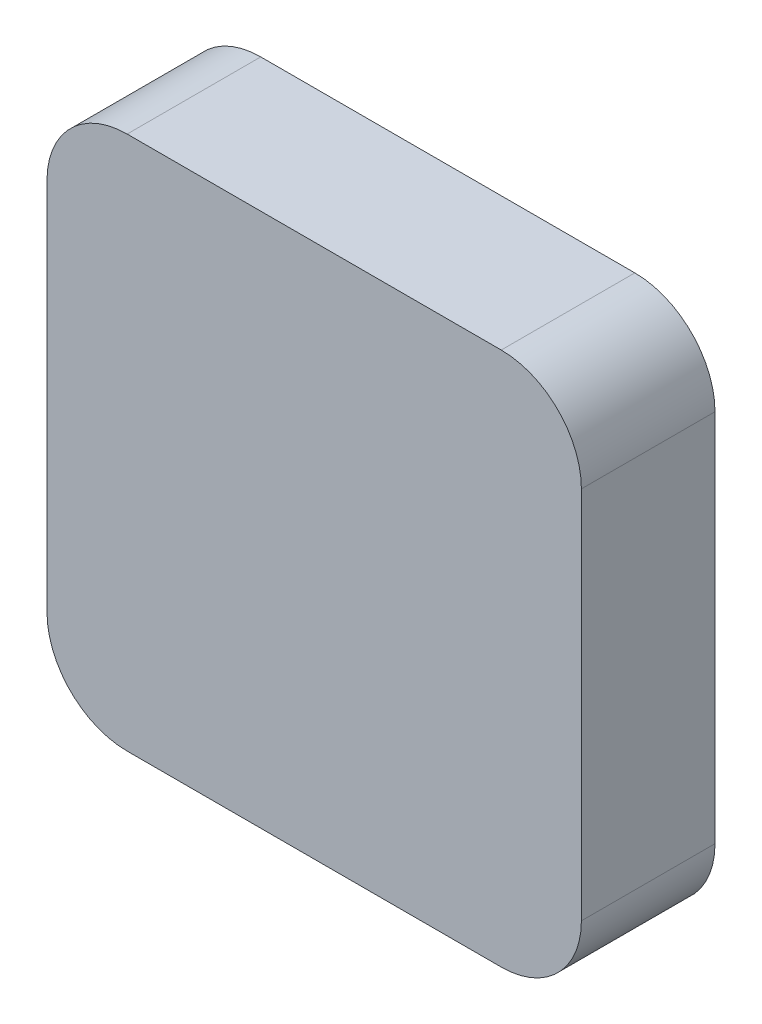
ISO-10303-21;
HEADER;
FILE_DESCRIPTION(('STEP AP214'),'2;1');
FILE_NAME('part.step','',(''),(''),'','','');
FILE_SCHEMA(('AUTOMOTIVE_DESIGN { 1 0 10303 214 1 1 1 1 }'));
ENDSEC;
DATA;
#1=APPLICATION_CONTEXT('core data for automotive mechanical design processes');
#2=APPLICATION_PROTOCOL_DEFINITION('international standard','automotive_design',2000,#1);
#3=PRODUCT_CONTEXT('',#1,'mechanical');
#4=PRODUCT('Part','Part','',(#3));
#5=PRODUCT_RELATED_PRODUCT_CATEGORY('part','',(#4));
#6=PRODUCT_DEFINITION_FORMATION('','',#4);
#7=PRODUCT_DEFINITION_CONTEXT('part definition',#1,'design');
#8=PRODUCT_DEFINITION('design','',#6,#7);
#9=PRODUCT_DEFINITION_SHAPE('','',#8);
#10=(LENGTH_UNIT() NAMED_UNIT(*) SI_UNIT(.MILLI.,.METRE.));
#11=(NAMED_UNIT(*) PLANE_ANGLE_UNIT() SI_UNIT($,.RADIAN.));
#12=(NAMED_UNIT(*) SI_UNIT($,.STERADIAN.) SOLID_ANGLE_UNIT());
#13=UNCERTAINTY_MEASURE_WITH_UNIT(LENGTH_MEASURE(1.E-05),#10,'distance_accuracy_value','');
#14=(GEOMETRIC_REPRESENTATION_CONTEXT(3) GLOBAL_UNCERTAINTY_ASSIGNED_CONTEXT((#13)) GLOBAL_UNIT_ASSIGNED_CONTEXT((#10,
#11,#12)) REPRESENTATION_CONTEXT('',''));
#15=CARTESIAN_POINT('',(0.,0.,0.));
#16=DIRECTION('',(0.,0.,1.));
#17=DIRECTION('',(1.,0.,0.));
#18=AXIS2_PLACEMENT_3D('',#15,#16,#17);
#19=CARTESIAN_POINT('',(10.,-10.,2.5));
#20=DIRECTION('',(-1.,0.,0.));
#21=DIRECTION('',(0.,0.,1.));
#22=AXIS2_PLACEMENT_3D('',#19,#20,#21);
#23=PLANE('',#22);
#24=DIRECTION('',(0.,1.,0.));
#25=VECTOR('',#24,1.);
#26=CARTESIAN_POINT('',(10.,-10.,2.5));
#27=LINE('',#26,#25);
#28=CARTESIAN_POINT('',(10.,-7.,2.5));
#29=VERTEX_POINT('',#28);
#30=CARTESIAN_POINT('',(10.,7.,2.5));
#31=VERTEX_POINT('',#30);
#32=EDGE_CURVE('E132',#29,#31,#27,.T.);
#33=ORIENTED_EDGE('',*,*,#32,.F.);
#34=DIRECTION('',(0.,0.,-1.));
#35=VECTOR('',#34,1.);
#36=CARTESIAN_POINT('',(10.,-7.,2.5));
#37=LINE('',#36,#35);
#38=CARTESIAN_POINT('',(10.,-7.,-2.5));
#39=VERTEX_POINT('',#38);
#40=EDGE_CURVE('E158',#29,#39,#37,.T.);
#41=ORIENTED_EDGE('',*,*,#40,.T.);
#42=DIRECTION('',(0.,1.,0.));
#43=VECTOR('',#42,1.);
#44=CARTESIAN_POINT('',(10.,-10.,-2.5));
#45=LINE('',#44,#43);
#46=CARTESIAN_POINT('',(10.,7.,-2.5));
#47=VERTEX_POINT('',#46);
#48=EDGE_CURVE('E166',#39,#47,#45,.T.);
#49=ORIENTED_EDGE('',*,*,#48,.T.);
#50=DIRECTION('',(0.,0.,-1.));
#51=VECTOR('',#50,1.);
#52=CARTESIAN_POINT('',(10.,7.,2.5));
#53=LINE('',#52,#51);
#54=EDGE_CURVE('E156',#47,#31,#53,.F.);
#55=ORIENTED_EDGE('',*,*,#54,.T.);
#56=EDGE_LOOP('',(#33,#41,#49,#55));
#57=FACE_BOUND('',#56,.T.);
#58=ADVANCED_FACE('F41',(#57),#23,.F.);
#59=CARTESIAN_POINT('',(-10.,10.,2.5));
#60=DIRECTION('',(0.,-1.,0.));
#61=DIRECTION('',(0.,0.,-1.));
#62=AXIS2_PLACEMENT_3D('',#59,#60,#61);
#63=PLANE('',#62);
#64=DIRECTION('',(-1.,0.,0.));
#65=VECTOR('',#64,1.);
#66=CARTESIAN_POINT('',(-10.,10.,-2.5));
#67=LINE('',#66,#65);
#68=CARTESIAN_POINT('',(7.,10.,-2.5));
#69=VERTEX_POINT('',#68);
#70=CARTESIAN_POINT('',(-7.,10.,-2.5));
#71=VERTEX_POINT('',#70);
#72=EDGE_CURVE('E137',#69,#71,#67,.T.);
#73=ORIENTED_EDGE('',*,*,#72,.T.);
#74=DIRECTION('',(0.,0.,-1.));
#75=VECTOR('',#74,1.);
#76=CARTESIAN_POINT('',(-7.,10.,2.5));
#77=LINE('',#76,#75);
#78=CARTESIAN_POINT('',(-7.,10.,2.5));
#79=VERTEX_POINT('',#78);
#80=EDGE_CURVE('E11',#71,#79,#77,.F.);
#81=ORIENTED_EDGE('',*,*,#80,.T.);
#82=DIRECTION('',(-1.,0.,0.));
#83=VECTOR('',#82,1.);
#84=CARTESIAN_POINT('',(-10.,10.,2.5));
#85=LINE('',#84,#83);
#86=CARTESIAN_POINT('',(7.,10.,2.5));
#87=VERTEX_POINT('',#86);
#88=EDGE_CURVE('E135',#87,#79,#85,.T.);
#89=ORIENTED_EDGE('',*,*,#88,.F.);
#90=DIRECTION('',(0.,0.,-1.));
#91=VECTOR('',#90,1.);
#92=CARTESIAN_POINT('',(7.,10.,2.5));
#93=LINE('',#92,#91);
#94=EDGE_CURVE('E49',#87,#69,#93,.T.);
#95=ORIENTED_EDGE('',*,*,#94,.T.);
#96=EDGE_LOOP('',(#73,#81,#89,#95));
#97=FACE_BOUND('',#96,.T.);
#98=ADVANCED_FACE('F163',(#97),#63,.F.);
#99=CARTESIAN_POINT('',(-10.,-10.,2.5));
#100=DIRECTION('',(1.,0.,0.));
#101=DIRECTION('',(0.,0.,-1.));
#102=AXIS2_PLACEMENT_3D('',#99,#100,#101);
#103=PLANE('',#102);
#104=DIRECTION('',(0.,-1.,0.));
#105=VECTOR('',#104,1.);
#106=CARTESIAN_POINT('',(-10.,-10.,-2.5));
#107=LINE('',#106,#105);
#108=CARTESIAN_POINT('',(-10.,7.,-2.5));
#109=VERTEX_POINT('',#108);
#110=CARTESIAN_POINT('',(-10.,-7.,-2.5));
#111=VERTEX_POINT('',#110);
#112=EDGE_CURVE('E133',#109,#111,#107,.T.);
#113=ORIENTED_EDGE('',*,*,#112,.T.);
#114=DIRECTION('',(0.,0.,-1.));
#115=VECTOR('',#114,1.);
#116=CARTESIAN_POINT('',(-10.,-7.,2.5));
#117=LINE('',#116,#115);
#118=CARTESIAN_POINT('',(-10.,-7.,2.5));
#119=VERTEX_POINT('',#118);
#120=EDGE_CURVE('E111',#111,#119,#117,.F.);
#121=ORIENTED_EDGE('',*,*,#120,.T.);
#122=DIRECTION('',(0.,-1.,0.));
#123=VECTOR('',#122,1.);
#124=CARTESIAN_POINT('',(-10.,-10.,2.5));
#125=LINE('',#124,#123);
#126=CARTESIAN_POINT('',(-10.,7.,2.5));
#127=VERTEX_POINT('',#126);
#128=EDGE_CURVE('E170',#127,#119,#125,.T.);
#129=ORIENTED_EDGE('',*,*,#128,.F.);
#130=DIRECTION('',(0.,0.,-1.));
#131=VECTOR('',#130,1.);
#132=CARTESIAN_POINT('',(-10.,7.,2.5));
#133=LINE('',#132,#131);
#134=EDGE_CURVE('E116',#127,#109,#133,.T.);
#135=ORIENTED_EDGE('',*,*,#134,.T.);
#136=EDGE_LOOP('',(#113,#121,#129,#135));
#137=FACE_BOUND('',#136,.T.);
#138=ADVANCED_FACE('F180',(#137),#103,.F.);
#139=CARTESIAN_POINT('',(-10.,-10.,2.5));
#140=DIRECTION('',(0.,1.,0.));
#141=DIRECTION('',(0.,0.,1.));
#142=AXIS2_PLACEMENT_3D('',#139,#140,#141);
#143=PLANE('',#142);
#144=DIRECTION('',(1.,0.,0.));
#145=VECTOR('',#144,1.);
#146=CARTESIAN_POINT('',(-10.,-10.,2.5));
#147=LINE('',#146,#145);
#148=CARTESIAN_POINT('',(-7.,-10.,2.5));
#149=VERTEX_POINT('',#148);
#150=CARTESIAN_POINT('',(7.,-10.,2.5));
#151=VERTEX_POINT('',#150);
#152=EDGE_CURVE('E126',#149,#151,#147,.T.);
#153=ORIENTED_EDGE('',*,*,#152,.F.);
#154=DIRECTION('',(0.,0.,-1.));
#155=VECTOR('',#154,1.);
#156=CARTESIAN_POINT('',(-7.,-10.,2.5));
#157=LINE('',#156,#155);
#158=CARTESIAN_POINT('',(-7.,-10.,-2.5));
#159=VERTEX_POINT('',#158);
#160=EDGE_CURVE('E110',#149,#159,#157,.T.);
#161=ORIENTED_EDGE('',*,*,#160,.T.);
#162=DIRECTION('',(1.,0.,0.));
#163=VECTOR('',#162,1.);
#164=CARTESIAN_POINT('',(-10.,-10.,-2.5));
#165=LINE('',#164,#163);
#166=CARTESIAN_POINT('',(7.,-10.,-2.5));
#167=VERTEX_POINT('',#166);
#168=EDGE_CURVE('E123',#159,#167,#165,.T.);
#169=ORIENTED_EDGE('',*,*,#168,.T.);
#170=DIRECTION('',(0.,0.,-1.));
#171=VECTOR('',#170,1.);
#172=CARTESIAN_POINT('',(7.,-10.,2.5));
#173=LINE('',#172,#171);
#174=EDGE_CURVE('E128',#167,#151,#173,.F.);
#175=ORIENTED_EDGE('',*,*,#174,.T.);
#176=EDGE_LOOP('',(#153,#161,#169,#175));
#177=FACE_BOUND('',#176,.T.);
#178=ADVANCED_FACE('F122',(#177),#143,.F.);
#179=CARTESIAN_POINT('',(0.,0.,2.5));
#180=DIRECTION('',(0.,0.,-1.));
#181=DIRECTION('',(-1.,0.,0.));
#182=AXIS2_PLACEMENT_3D('',#179,#180,#181);
#183=PLANE('',#182);
#184=ORIENTED_EDGE('',*,*,#128,.T.);
#185=CARTESIAN_POINT('',(-7.,-7.,2.5));
#186=DIRECTION('',(0.,0.,-1.));
#187=DIRECTION('',(-1.,0.,0.));
#188=AXIS2_PLACEMENT_3D('',#185,#186,#187);
#189=CIRCLE('',#188,3.);
#190=EDGE_CURVE('E154',#119,#149,#189,.F.);
#191=ORIENTED_EDGE('',*,*,#190,.T.);
#192=ORIENTED_EDGE('',*,*,#152,.T.);
#193=CARTESIAN_POINT('',(7.,-7.,2.5));
#194=DIRECTION('',(0.,0.,-1.));
#195=DIRECTION('',(-1.,0.,0.));
#196=AXIS2_PLACEMENT_3D('',#193,#194,#195);
#197=CIRCLE('',#196,3.);
#198=EDGE_CURVE('E152',#151,#29,#197,.F.);
#199=ORIENTED_EDGE('',*,*,#198,.T.);
#200=ORIENTED_EDGE('',*,*,#32,.T.);
#201=CARTESIAN_POINT('',(7.,7.,2.5));
#202=DIRECTION('',(0.,0.,-1.));
#203=DIRECTION('',(-1.,0.,0.));
#204=AXIS2_PLACEMENT_3D('',#201,#202,#203);
#205=CIRCLE('',#204,3.);
#206=EDGE_CURVE('E61',#31,#87,#205,.F.);
#207=ORIENTED_EDGE('',*,*,#206,.T.);
#208=ORIENTED_EDGE('',*,*,#88,.T.);
#209=CARTESIAN_POINT('',(-7.,7.,2.5));
#210=DIRECTION('',(0.,0.,-1.));
#211=DIRECTION('',(-1.,0.,0.));
#212=AXIS2_PLACEMENT_3D('',#209,#210,#211);
#213=CIRCLE('',#212,3.);
#214=EDGE_CURVE('E150',#79,#127,#213,.F.);
#215=ORIENTED_EDGE('',*,*,#214,.T.);
#216=EDGE_LOOP('',(#184,#191,#192,#199,#200,#207,#208,#215));
#217=FACE_BOUND('',#216,.T.);
#218=ADVANCED_FACE('F174',(#217),#183,.F.);
#219=CARTESIAN_POINT('',(0.,0.,-2.5));
#220=DIRECTION('',(0.,0.,-1.));
#221=DIRECTION('',(-1.,0.,0.));
#222=AXIS2_PLACEMENT_3D('',#219,#220,#221);
#223=PLANE('',#222);
#224=ORIENTED_EDGE('',*,*,#168,.F.);
#225=CARTESIAN_POINT('',(-7.,-7.,-2.5));
#226=DIRECTION('',(0.,0.,-1.));
#227=DIRECTION('',(-1.,0.,0.));
#228=AXIS2_PLACEMENT_3D('',#225,#226,#227);
#229=CIRCLE('',#228,3.);
#230=EDGE_CURVE('E106',#159,#111,#229,.T.);
#231=ORIENTED_EDGE('',*,*,#230,.T.);
#232=ORIENTED_EDGE('',*,*,#112,.F.);
#233=CARTESIAN_POINT('',(-7.,7.,-2.5));
#234=DIRECTION('',(0.,0.,-1.));
#235=DIRECTION('',(-1.,0.,0.));
#236=AXIS2_PLACEMENT_3D('',#233,#234,#235);
#237=CIRCLE('',#236,3.);
#238=EDGE_CURVE('E143',#109,#71,#237,.T.);
#239=ORIENTED_EDGE('',*,*,#238,.T.);
#240=ORIENTED_EDGE('',*,*,#72,.F.);
#241=CARTESIAN_POINT('',(7.,7.,-2.5));
#242=DIRECTION('',(0.,0.,-1.));
#243=DIRECTION('',(-1.,0.,0.));
#244=AXIS2_PLACEMENT_3D('',#241,#242,#243);
#245=CIRCLE('',#244,3.);
#246=EDGE_CURVE('E127',#69,#47,#245,.T.);
#247=ORIENTED_EDGE('',*,*,#246,.T.);
#248=ORIENTED_EDGE('',*,*,#48,.F.);
#249=CARTESIAN_POINT('',(7.,-7.,-2.5));
#250=DIRECTION('',(0.,0.,-1.));
#251=DIRECTION('',(-1.,0.,0.));
#252=AXIS2_PLACEMENT_3D('',#249,#250,#251);
#253=CIRCLE('',#252,3.);
#254=EDGE_CURVE('E117',#39,#167,#253,.T.);
#255=ORIENTED_EDGE('',*,*,#254,.T.);
#256=EDGE_LOOP('',(#224,#231,#232,#239,#240,#247,#248,#255));
#257=FACE_BOUND('',#256,.T.);
#258=ADVANCED_FACE('F130',(#257),#223,.T.);
#259=CARTESIAN_POINT('',(-7.,-7.,2.5));
#260=DIRECTION('',(0.,0.,-1.));
#261=DIRECTION('',(-1.,0.,0.));
#262=AXIS2_PLACEMENT_3D('',#259,#260,#261);
#263=CYLINDRICAL_SURFACE('',#262,3.);
#264=ORIENTED_EDGE('',*,*,#190,.F.);
#265=ORIENTED_EDGE('',*,*,#120,.F.);
#266=ORIENTED_EDGE('',*,*,#230,.F.);
#267=ORIENTED_EDGE('',*,*,#160,.F.);
#268=EDGE_LOOP('',(#264,#265,#266,#267));
#269=FACE_BOUND('',#268,.T.);
#270=ADVANCED_FACE('F109',(#269),#263,.T.);
#271=CARTESIAN_POINT('',(7.,-7.,2.5));
#272=DIRECTION('',(0.,0.,-1.));
#273=DIRECTION('',(-1.,0.,0.));
#274=AXIS2_PLACEMENT_3D('',#271,#272,#273);
#275=CYLINDRICAL_SURFACE('',#274,3.);
#276=ORIENTED_EDGE('',*,*,#198,.F.);
#277=ORIENTED_EDGE('',*,*,#174,.F.);
#278=ORIENTED_EDGE('',*,*,#254,.F.);
#279=ORIENTED_EDGE('',*,*,#40,.F.);
#280=EDGE_LOOP('',(#276,#277,#278,#279));
#281=FACE_BOUND('',#280,.T.);
#282=ADVANCED_FACE('F185',(#281),#275,.T.);
#283=CARTESIAN_POINT('',(-7.,7.,2.5));
#284=DIRECTION('',(0.,0.,-1.));
#285=DIRECTION('',(-1.,0.,0.));
#286=AXIS2_PLACEMENT_3D('',#283,#284,#285);
#287=CYLINDRICAL_SURFACE('',#286,3.);
#288=ORIENTED_EDGE('',*,*,#214,.F.);
#289=ORIENTED_EDGE('',*,*,#80,.F.);
#290=ORIENTED_EDGE('',*,*,#238,.F.);
#291=ORIENTED_EDGE('',*,*,#134,.F.);
#292=EDGE_LOOP('',(#288,#289,#290,#291));
#293=FACE_BOUND('',#292,.T.);
#294=ADVANCED_FACE('F178',(#293),#287,.T.);
#295=CARTESIAN_POINT('',(7.,7.,2.5));
#296=DIRECTION('',(0.,0.,-1.));
#297=DIRECTION('',(-1.,0.,0.));
#298=AXIS2_PLACEMENT_3D('',#295,#296,#297);
#299=CYLINDRICAL_SURFACE('',#298,3.);
#300=ORIENTED_EDGE('',*,*,#206,.F.);
#301=ORIENTED_EDGE('',*,*,#54,.F.);
#302=ORIENTED_EDGE('',*,*,#246,.F.);
#303=ORIENTED_EDGE('',*,*,#94,.F.);
#304=EDGE_LOOP('',(#300,#301,#302,#303));
#305=FACE_BOUND('',#304,.T.);
#306=ADVANCED_FACE('F43',(#305),#299,.T.);
#307=CLOSED_SHELL('',(#58,#98,#138,#178,#218,#258,#270,#282,#294,#306));
#308=MANIFOLD_SOLID_BREP('B2',#307);
#309=ADVANCED_BREP_SHAPE_REPRESENTATION('',(#18,#308),#14);
#310=SHAPE_DEFINITION_REPRESENTATION(#9,#309);
ENDSEC;
END-ISO-10303-21;
